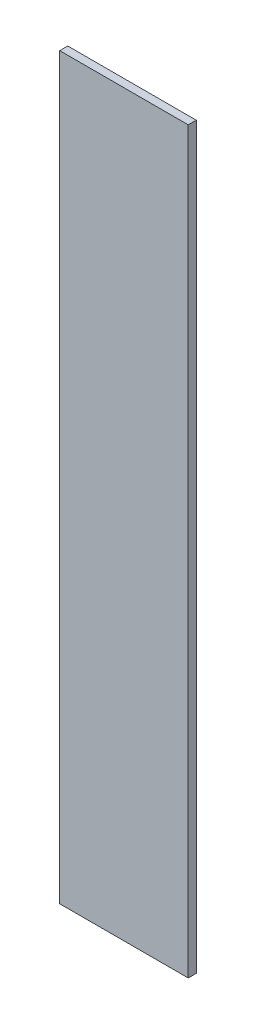
ISO-10303-21;
HEADER;
FILE_DESCRIPTION(('STEP AP214'),'2;1');
FILE_NAME('part.step','',(''),(''),'','','');
FILE_SCHEMA(('AUTOMOTIVE_DESIGN { 1 0 10303 214 1 1 1 1 }'));
ENDSEC;
DATA;
#1=APPLICATION_CONTEXT('core data for automotive mechanical design processes');
#2=APPLICATION_PROTOCOL_DEFINITION('international standard','automotive_design',2000,#1);
#3=PRODUCT_CONTEXT('',#1,'mechanical');
#4=PRODUCT('Part','Part','',(#3));
#5=PRODUCT_RELATED_PRODUCT_CATEGORY('part','',(#4));
#6=PRODUCT_DEFINITION_FORMATION('','',#4);
#7=PRODUCT_DEFINITION_CONTEXT('part definition',#1,'design');
#8=PRODUCT_DEFINITION('design','',#6,#7);
#9=PRODUCT_DEFINITION_SHAPE('','',#8);
#10=(LENGTH_UNIT() NAMED_UNIT(*) SI_UNIT(.MILLI.,.METRE.));
#11=(NAMED_UNIT(*) PLANE_ANGLE_UNIT() SI_UNIT($,.RADIAN.));
#12=(NAMED_UNIT(*) SI_UNIT($,.STERADIAN.) SOLID_ANGLE_UNIT());
#13=UNCERTAINTY_MEASURE_WITH_UNIT(LENGTH_MEASURE(1.E-05),#10,'distance_accuracy_value','');
#14=(GEOMETRIC_REPRESENTATION_CONTEXT(3) GLOBAL_UNCERTAINTY_ASSIGNED_CONTEXT((#13)) GLOBAL_UNIT_ASSIGNED_CONTEXT((#10,
#11,#12)) REPRESENTATION_CONTEXT('',''));
#15=CARTESIAN_POINT('',(0.,0.,0.));
#16=DIRECTION('',(0.,0.,1.));
#17=DIRECTION('',(1.,0.,0.));
#18=AXIS2_PLACEMENT_3D('',#15,#16,#17);
#19=CARTESIAN_POINT('',(0.,0.,3.175));
#20=DIRECTION('',(1.,0.,0.));
#21=DIRECTION('',(0.,0.,-1.));
#22=AXIS2_PLACEMENT_3D('',#19,#20,#21);
#23=PLANE('',#22);
#24=DIRECTION('',(0.,-1.,0.));
#25=VECTOR('',#24,1.);
#26=CARTESIAN_POINT('',(0.,0.,0.));
#27=LINE('',#26,#25);
#28=CARTESIAN_POINT('',(0.,292.1,0.));
#29=VERTEX_POINT('',#28);
#30=CARTESIAN_POINT('',(0.,0.,0.));
#31=VERTEX_POINT('',#30);
#32=EDGE_CURVE('E96',#29,#31,#27,.T.);
#33=ORIENTED_EDGE('',*,*,#32,.T.);
#34=DIRECTION('',(0.,0.,-1.));
#35=VECTOR('',#34,1.);
#36=CARTESIAN_POINT('',(0.,0.,3.175));
#37=LINE('',#36,#35);
#38=CARTESIAN_POINT('',(0.,0.,3.175));
#39=VERTEX_POINT('',#38);
#40=EDGE_CURVE('E11',#39,#31,#37,.T.);
#41=ORIENTED_EDGE('',*,*,#40,.F.);
#42=DIRECTION('',(0.,-1.,0.));
#43=VECTOR('',#42,1.);
#44=CARTESIAN_POINT('',(0.,0.,3.175));
#45=LINE('',#44,#43);
#46=CARTESIAN_POINT('',(0.,292.1,3.175));
#47=VERTEX_POINT('',#46);
#48=EDGE_CURVE('E84',#47,#39,#45,.T.);
#49=ORIENTED_EDGE('',*,*,#48,.F.);
#50=DIRECTION('',(0.,0.,-1.));
#51=VECTOR('',#50,1.);
#52=CARTESIAN_POINT('',(0.,292.1,3.175));
#53=LINE('',#52,#51);
#54=EDGE_CURVE('E92',#47,#29,#53,.T.);
#55=ORIENTED_EDGE('',*,*,#54,.T.);
#56=EDGE_LOOP('',(#33,#41,#49,#55));
#57=FACE_BOUND('',#56,.T.);
#58=ADVANCED_FACE('F33',(#57),#23,.F.);
#59=CARTESIAN_POINT('',(0.,0.,3.175));
#60=DIRECTION('',(0.,1.,0.));
#61=DIRECTION('',(0.,0.,1.));
#62=AXIS2_PLACEMENT_3D('',#59,#60,#61);
#63=PLANE('',#62);
#64=DIRECTION('',(1.,0.,0.));
#65=VECTOR('',#64,1.);
#66=CARTESIAN_POINT('',(0.,0.,0.));
#67=LINE('',#66,#65);
#68=CARTESIAN_POINT('',(50.8,0.,0.));
#69=VERTEX_POINT('',#68);
#70=EDGE_CURVE('E88',#31,#69,#67,.T.);
#71=ORIENTED_EDGE('',*,*,#70,.T.);
#72=DIRECTION('',(0.,0.,-1.));
#73=VECTOR('',#72,1.);
#74=CARTESIAN_POINT('',(50.8,0.,3.175));
#75=LINE('',#74,#73);
#76=CARTESIAN_POINT('',(50.8,0.,3.175));
#77=VERTEX_POINT('',#76);
#78=EDGE_CURVE('E41',#77,#69,#75,.T.);
#79=ORIENTED_EDGE('',*,*,#78,.F.);
#80=DIRECTION('',(1.,0.,0.));
#81=VECTOR('',#80,1.);
#82=CARTESIAN_POINT('',(0.,0.,3.175));
#83=LINE('',#82,#81);
#84=EDGE_CURVE('E79',#39,#77,#83,.T.);
#85=ORIENTED_EDGE('',*,*,#84,.F.);
#86=ORIENTED_EDGE('',*,*,#40,.T.);
#87=EDGE_LOOP('',(#71,#79,#85,#86));
#88=FACE_BOUND('',#87,.T.);
#89=ADVANCED_FACE('F87',(#88),#63,.F.);
#90=CARTESIAN_POINT('',(50.8,0.,3.175));
#91=DIRECTION('',(-1.,0.,0.));
#92=DIRECTION('',(0.,0.,1.));
#93=AXIS2_PLACEMENT_3D('',#90,#91,#92);
#94=PLANE('',#93);
#95=DIRECTION('',(0.,1.,0.));
#96=VECTOR('',#95,1.);
#97=CARTESIAN_POINT('',(50.8,0.,0.));
#98=LINE('',#97,#96);
#99=CARTESIAN_POINT('',(50.8,292.1,0.));
#100=VERTEX_POINT('',#99);
#101=EDGE_CURVE('E66',#69,#100,#98,.T.);
#102=ORIENTED_EDGE('',*,*,#101,.T.);
#103=DIRECTION('',(0.,0.,-1.));
#104=VECTOR('',#103,1.);
#105=CARTESIAN_POINT('',(50.8,292.1,3.175));
#106=LINE('',#105,#104);
#107=CARTESIAN_POINT('',(50.8,292.1,3.175));
#108=VERTEX_POINT('',#107);
#109=EDGE_CURVE('E89',#108,#100,#106,.T.);
#110=ORIENTED_EDGE('',*,*,#109,.F.);
#111=DIRECTION('',(0.,1.,0.));
#112=VECTOR('',#111,1.);
#113=CARTESIAN_POINT('',(50.8,0.,3.175));
#114=LINE('',#113,#112);
#115=EDGE_CURVE('E82',#77,#108,#114,.T.);
#116=ORIENTED_EDGE('',*,*,#115,.F.);
#117=ORIENTED_EDGE('',*,*,#78,.T.);
#118=EDGE_LOOP('',(#102,#110,#116,#117));
#119=FACE_BOUND('',#118,.T.);
#120=ADVANCED_FACE('F90',(#119),#94,.F.);
#121=CARTESIAN_POINT('',(0.,292.1,3.175));
#122=DIRECTION('',(0.,-1.,0.));
#123=DIRECTION('',(0.,0.,-1.));
#124=AXIS2_PLACEMENT_3D('',#121,#122,#123);
#125=PLANE('',#124);
#126=DIRECTION('',(-1.,0.,0.));
#127=VECTOR('',#126,1.);
#128=CARTESIAN_POINT('',(0.,292.1,0.));
#129=LINE('',#128,#127);
#130=EDGE_CURVE('E72',#100,#29,#129,.T.);
#131=ORIENTED_EDGE('',*,*,#130,.T.);
#132=ORIENTED_EDGE('',*,*,#54,.F.);
#133=DIRECTION('',(-1.,0.,0.));
#134=VECTOR('',#133,1.);
#135=CARTESIAN_POINT('',(0.,292.1,3.175));
#136=LINE('',#135,#134);
#137=EDGE_CURVE('E49',#108,#47,#136,.T.);
#138=ORIENTED_EDGE('',*,*,#137,.F.);
#139=ORIENTED_EDGE('',*,*,#109,.T.);
#140=EDGE_LOOP('',(#131,#132,#138,#139));
#141=FACE_BOUND('',#140,.T.);
#142=ADVANCED_FACE('F103',(#141),#125,.F.);
#143=CARTESIAN_POINT('',(0.,0.,3.175));
#144=DIRECTION('',(0.,0.,-1.));
#145=DIRECTION('',(-1.,0.,0.));
#146=AXIS2_PLACEMENT_3D('',#143,#144,#145);
#147=PLANE('',#146);
#148=ORIENTED_EDGE('',*,*,#48,.T.);
#149=ORIENTED_EDGE('',*,*,#84,.T.);
#150=ORIENTED_EDGE('',*,*,#115,.T.);
#151=ORIENTED_EDGE('',*,*,#137,.T.);
#152=EDGE_LOOP('',(#148,#149,#150,#151));
#153=FACE_BOUND('',#152,.T.);
#154=ADVANCED_FACE('F80',(#153),#147,.F.);
#155=CARTESIAN_POINT('',(0.,0.,0.));
#156=DIRECTION('',(0.,0.,-1.));
#157=DIRECTION('',(-1.,0.,0.));
#158=AXIS2_PLACEMENT_3D('',#155,#156,#157);
#159=PLANE('',#158);
#160=ORIENTED_EDGE('',*,*,#32,.F.);
#161=ORIENTED_EDGE('',*,*,#130,.F.);
#162=ORIENTED_EDGE('',*,*,#101,.F.);
#163=ORIENTED_EDGE('',*,*,#70,.F.);
#164=EDGE_LOOP('',(#160,#161,#162,#163));
#165=FACE_BOUND('',#164,.T.);
#166=ADVANCED_FACE('F106',(#165),#159,.T.);
#167=CLOSED_SHELL('',(#58,#89,#120,#142,#154,#166));
#168=MANIFOLD_SOLID_BREP('B2',#167);
#169=ADVANCED_BREP_SHAPE_REPRESENTATION('',(#18,#168),#14);
#170=SHAPE_DEFINITION_REPRESENTATION(#9,#169);
ENDSEC;
END-ISO-10303-21;
